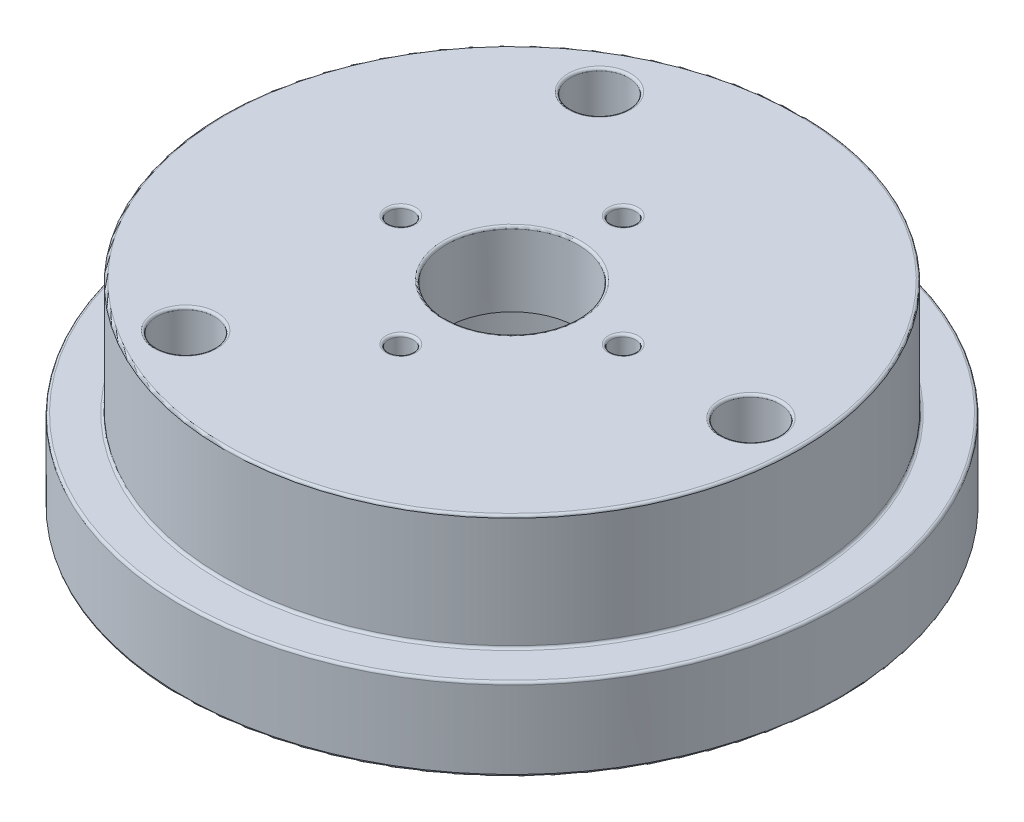
ISO-10303-21;
HEADER;
FILE_DESCRIPTION(('STEP AP214'),'2;1');
FILE_NAME('part.step','',(''),(''),'','','');
FILE_SCHEMA(('AUTOMOTIVE_DESIGN { 1 0 10303 214 1 1 1 1 }'));
ENDSEC;
DATA;
#1=APPLICATION_CONTEXT('core data for automotive mechanical design processes');
#2=APPLICATION_PROTOCOL_DEFINITION('international standard','automotive_design',2000,#1);
#3=PRODUCT_CONTEXT('',#1,'mechanical');
#4=PRODUCT('Part','Part','',(#3));
#5=PRODUCT_RELATED_PRODUCT_CATEGORY('part','',(#4));
#6=PRODUCT_DEFINITION_FORMATION('','',#4);
#7=PRODUCT_DEFINITION_CONTEXT('part definition',#1,'design');
#8=PRODUCT_DEFINITION('design','',#6,#7);
#9=PRODUCT_DEFINITION_SHAPE('','',#8);
#10=(LENGTH_UNIT() NAMED_UNIT(*) SI_UNIT(.MILLI.,.METRE.));
#11=(NAMED_UNIT(*) PLANE_ANGLE_UNIT() SI_UNIT($,.RADIAN.));
#12=(NAMED_UNIT(*) SI_UNIT($,.STERADIAN.) SOLID_ANGLE_UNIT());
#13=UNCERTAINTY_MEASURE_WITH_UNIT(LENGTH_MEASURE(1.E-05),#10,'distance_accuracy_value','');
#14=(GEOMETRIC_REPRESENTATION_CONTEXT(3) GLOBAL_UNCERTAINTY_ASSIGNED_CONTEXT((#13)) GLOBAL_UNIT_ASSIGNED_CONTEXT((#10,
#11,#12)) REPRESENTATION_CONTEXT('',''));
#15=CARTESIAN_POINT('',(0.,0.,0.));
#16=DIRECTION('',(0.,0.,1.));
#17=DIRECTION('',(1.,0.,0.));
#18=AXIS2_PLACEMENT_3D('',#15,#16,#17);
#19=CARTESIAN_POINT('',(0.,12.,0.));
#20=DIRECTION('',(0.,-1.,0.));
#21=DIRECTION('',(1.,0.,0.));
#22=AXIS2_PLACEMENT_3D('',#19,#20,#21);
#23=CYLINDRICAL_SURFACE('',#22,4.);
#24=CARTESIAN_POINT('',(0.,11.85,0.));
#25=DIRECTION('',(0.,1.,0.));
#26=DIRECTION('',(-1.,0.,0.));
#27=AXIS2_PLACEMENT_3D('',#24,#25,#26);
#28=CIRCLE('',#27,4.);
#29=CARTESIAN_POINT('',(-4.,11.85,0.));
#30=VERTEX_POINT('',#29);
#31=EDGE_CURVE('E56',#30,#30,#28,.T.);
#32=ORIENTED_EDGE('',*,*,#31,.T.);
#33=EDGE_LOOP('',(#32));
#34=FACE_BOUND('',#33,.T.);
#35=CARTESIAN_POINT('',(0.,7.5,0.));
#36=DIRECTION('',(0.,-1.,0.));
#37=DIRECTION('',(1.,0.,0.));
#38=AXIS2_PLACEMENT_3D('',#35,#36,#37);
#39=CIRCLE('',#38,4.);
#40=CARTESIAN_POINT('',(4.,7.5,0.));
#41=VERTEX_POINT('',#40);
#42=EDGE_CURVE('E143',#41,#41,#39,.T.);
#43=ORIENTED_EDGE('',*,*,#42,.T.);
#44=EDGE_LOOP('',(#43));
#45=FACE_BOUND('',#44,.T.);
#46=ADVANCED_FACE('F36',(#34,#45),#23,.F.);
#47=CARTESIAN_POINT('',(0.,12.,6.75));
#48=DIRECTION('',(0.,-1.,0.));
#49=DIRECTION('',(1.,0.,0.));
#50=AXIS2_PLACEMENT_3D('',#47,#48,#49);
#51=CYLINDRICAL_SURFACE('',#50,0.75);
#52=CARTESIAN_POINT('',(0.,11.85,6.75));
#53=DIRECTION('',(0.,1.,0.));
#54=DIRECTION('',(-1.,0.,0.));
#55=AXIS2_PLACEMENT_3D('',#52,#53,#54);
#56=CIRCLE('',#55,0.75);
#57=CARTESIAN_POINT('',(-0.75,11.85,6.75));
#58=VERTEX_POINT('',#57);
#59=EDGE_CURVE('E51',#58,#58,#56,.T.);
#60=ORIENTED_EDGE('',*,*,#59,.T.);
#61=EDGE_LOOP('',(#60));
#62=FACE_BOUND('',#61,.T.);
#63=CARTESIAN_POINT('',(0.,7.5,6.75));
#64=DIRECTION('',(0.,-1.,0.));
#65=DIRECTION('',(1.,0.,0.));
#66=AXIS2_PLACEMENT_3D('',#63,#64,#65);
#67=CIRCLE('',#66,0.75);
#68=CARTESIAN_POINT('',(0.75,7.5,6.75));
#69=VERTEX_POINT('',#68);
#70=EDGE_CURVE('E155',#69,#69,#67,.T.);
#71=ORIENTED_EDGE('',*,*,#70,.T.);
#72=EDGE_LOOP('',(#71));
#73=FACE_BOUND('',#72,.T.);
#74=ADVANCED_FACE('F159',(#62,#73),#51,.F.);
#75=CARTESIAN_POINT('',(-6.75,12.,0.));
#76=DIRECTION('',(0.,-1.,0.));
#77=DIRECTION('',(1.,0.,0.));
#78=AXIS2_PLACEMENT_3D('',#75,#76,#77);
#79=CYLINDRICAL_SURFACE('',#78,0.749999999999999);
#80=CARTESIAN_POINT('',(-6.75,11.85,0.));
#81=DIRECTION('',(0.,1.,0.));
#82=DIRECTION('',(-1.,0.,0.));
#83=AXIS2_PLACEMENT_3D('',#80,#81,#82);
#84=CIRCLE('',#83,0.749999999999999);
#85=CARTESIAN_POINT('',(-7.5,11.85,0.));
#86=VERTEX_POINT('',#85);
#87=EDGE_CURVE('E47',#86,#86,#84,.T.);
#88=ORIENTED_EDGE('',*,*,#87,.T.);
#89=EDGE_LOOP('',(#88));
#90=FACE_BOUND('',#89,.T.);
#91=CARTESIAN_POINT('',(-6.75,7.5,0.));
#92=DIRECTION('',(0.,-1.,0.));
#93=DIRECTION('',(1.,0.,0.));
#94=AXIS2_PLACEMENT_3D('',#91,#92,#93);
#95=CIRCLE('',#94,0.749999999999999);
#96=CARTESIAN_POINT('',(-6.,7.5,0.));
#97=VERTEX_POINT('',#96);
#98=EDGE_CURVE('E152',#97,#97,#95,.T.);
#99=ORIENTED_EDGE('',*,*,#98,.T.);
#100=EDGE_LOOP('',(#99));
#101=FACE_BOUND('',#100,.T.);
#102=ADVANCED_FACE('F194',(#90,#101),#79,.F.);
#103=CARTESIAN_POINT('',(6.75,12.,0.));
#104=DIRECTION('',(0.,-1.,0.));
#105=DIRECTION('',(1.,0.,0.));
#106=AXIS2_PLACEMENT_3D('',#103,#104,#105);
#107=CYLINDRICAL_SURFACE('',#106,0.749999999999999);
#108=CARTESIAN_POINT('',(6.75,11.85,0.));
#109=DIRECTION('',(0.,1.,0.));
#110=DIRECTION('',(-1.,0.,0.));
#111=AXIS2_PLACEMENT_3D('',#108,#109,#110);
#112=CIRCLE('',#111,0.749999999999999);
#113=CARTESIAN_POINT('',(6.,11.85,0.));
#114=VERTEX_POINT('',#113);
#115=EDGE_CURVE('E43',#114,#114,#112,.T.);
#116=ORIENTED_EDGE('',*,*,#115,.T.);
#117=EDGE_LOOP('',(#116));
#118=FACE_BOUND('',#117,.T.);
#119=CARTESIAN_POINT('',(6.75,7.5,0.));
#120=DIRECTION('',(0.,-1.,0.));
#121=DIRECTION('',(1.,0.,0.));
#122=AXIS2_PLACEMENT_3D('',#119,#120,#121);
#123=CIRCLE('',#122,0.749999999999999);
#124=CARTESIAN_POINT('',(7.5,7.5,0.));
#125=VERTEX_POINT('',#124);
#126=EDGE_CURVE('E146',#125,#125,#123,.T.);
#127=ORIENTED_EDGE('',*,*,#126,.T.);
#128=EDGE_LOOP('',(#127));
#129=FACE_BOUND('',#128,.T.);
#130=ADVANCED_FACE('F452',(#118,#129),#107,.F.);
#131=CARTESIAN_POINT('',(0.,12.,-6.75));
#132=DIRECTION('',(0.,-1.,0.));
#133=DIRECTION('',(1.,0.,0.));
#134=AXIS2_PLACEMENT_3D('',#131,#132,#133);
#135=CYLINDRICAL_SURFACE('',#134,0.75);
#136=CARTESIAN_POINT('',(0.,11.85,-6.75));
#137=DIRECTION('',(0.,1.,0.));
#138=DIRECTION('',(-1.,0.,0.));
#139=AXIS2_PLACEMENT_3D('',#136,#137,#138);
#140=CIRCLE('',#139,0.75);
#141=CARTESIAN_POINT('',(-0.749999999999999,11.85,-6.75));
#142=VERTEX_POINT('',#141);
#143=EDGE_CURVE('E10',#142,#142,#140,.T.);
#144=ORIENTED_EDGE('',*,*,#143,.T.);
#145=EDGE_LOOP('',(#144));
#146=FACE_BOUND('',#145,.T.);
#147=CARTESIAN_POINT('',(0.,7.5,-6.75));
#148=DIRECTION('',(0.,-1.,0.));
#149=DIRECTION('',(1.,0.,0.));
#150=AXIS2_PLACEMENT_3D('',#147,#148,#149);
#151=CIRCLE('',#150,0.75);
#152=CARTESIAN_POINT('',(0.750000000000001,7.5,-6.75));
#153=VERTEX_POINT('',#152);
#154=EDGE_CURVE('E149',#153,#153,#151,.T.);
#155=ORIENTED_EDGE('',*,*,#154,.T.);
#156=EDGE_LOOP('',(#155));
#157=FACE_BOUND('',#156,.T.);
#158=ADVANCED_FACE('F220',(#146,#157),#135,.F.);
#159=CARTESIAN_POINT('',(0.,0.,0.));
#160=DIRECTION('',(0.,-1.,0.));
#161=DIRECTION('',(1.,0.,0.));
#162=AXIS2_PLACEMENT_3D('',#159,#160,#161);
#163=PLANE('',#162);
#164=CARTESIAN_POINT('',(0.,0.,0.));
#165=DIRECTION('',(0.,-1.,0.));
#166=DIRECTION('',(1.,0.,0.));
#167=AXIS2_PLACEMENT_3D('',#164,#165,#166);
#168=CIRCLE('',#167,19.85);
#169=CARTESIAN_POINT('',(19.85,0.,0.));
#170=VERTEX_POINT('',#169);
#171=EDGE_CURVE('E119',#170,#170,#168,.T.);
#172=ORIENTED_EDGE('',*,*,#171,.T.);
#173=EDGE_LOOP('',(#172));
#174=FACE_BOUND('',#173,.T.);
#175=CARTESIAN_POINT('',(-7.25,0.,12.5573683548744));
#176=DIRECTION('',(0.,-1.,0.));
#177=DIRECTION('',(1.,0.,0.));
#178=AXIS2_PLACEMENT_3D('',#175,#176,#177);
#179=CIRCLE('',#178,1.89999999999996);
#180=CARTESIAN_POINT('',(-5.35000000000004,0.,12.5573683548744));
#181=VERTEX_POINT('',#180);
#182=EDGE_CURVE('E122',#181,#181,#179,.F.);
#183=ORIENTED_EDGE('',*,*,#182,.T.);
#184=EDGE_LOOP('',(#183));
#185=FACE_BOUND('',#184,.T.);
#186=CARTESIAN_POINT('',(14.5,0.,0.));
#187=DIRECTION('',(0.,-1.,0.));
#188=DIRECTION('',(1.,0.,0.));
#189=AXIS2_PLACEMENT_3D('',#186,#187,#188);
#190=CIRCLE('',#189,1.9);
#191=CARTESIAN_POINT('',(16.4,0.,0.));
#192=VERTEX_POINT('',#191);
#193=EDGE_CURVE('E125',#192,#192,#190,.F.);
#194=ORIENTED_EDGE('',*,*,#193,.T.);
#195=EDGE_LOOP('',(#194));
#196=FACE_BOUND('',#195,.T.);
#197=CARTESIAN_POINT('',(-7.24999999999999,0.,-12.5573683548744));
#198=DIRECTION('',(0.,-1.,0.));
#199=DIRECTION('',(1.,0.,0.));
#200=AXIS2_PLACEMENT_3D('',#197,#198,#199);
#201=CIRCLE('',#200,1.89999999999998);
#202=CARTESIAN_POINT('',(-5.35000000000002,0.,-12.5573683548744));
#203=VERTEX_POINT('',#202);
#204=EDGE_CURVE('E128',#203,#203,#201,.F.);
#205=ORIENTED_EDGE('',*,*,#204,.T.);
#206=EDGE_LOOP('',(#205));
#207=FACE_BOUND('',#206,.T.);
#208=CARTESIAN_POINT('',(0.,0.,0.));
#209=DIRECTION('',(0.,-1.,0.));
#210=DIRECTION('',(1.,0.,0.));
#211=AXIS2_PLACEMENT_3D('',#208,#209,#210);
#212=CIRCLE('',#211,10.15);
#213=CARTESIAN_POINT('',(10.15,0.,0.));
#214=VERTEX_POINT('',#213);
#215=EDGE_CURVE('E131',#214,#214,#212,.F.);
#216=ORIENTED_EDGE('',*,*,#215,.T.);
#217=EDGE_LOOP('',(#216));
#218=FACE_BOUND('',#217,.T.);
#219=ADVANCED_FACE('F216',(#174,#185,#196,#207,#218),#163,.T.);
#220=CARTESIAN_POINT('',(0.,12.,0.));
#221=DIRECTION('',(0.,1.,0.));
#222=DIRECTION('',(-1.,0.,0.));
#223=AXIS2_PLACEMENT_3D('',#220,#221,#222);
#224=CYLINDRICAL_SURFACE('',#223,20.);
#225=CARTESIAN_POINT('',(0.,0.149999999999999,0.));
#226=DIRECTION('',(0.,-1.,0.));
#227=DIRECTION('',(1.,0.,0.));
#228=AXIS2_PLACEMENT_3D('',#225,#226,#227);
#229=CIRCLE('',#228,20.);
#230=CARTESIAN_POINT('',(20.,0.149999999999999,0.));
#231=VERTEX_POINT('',#230);
#232=EDGE_CURVE('E134',#231,#231,#229,.F.);
#233=ORIENTED_EDGE('',*,*,#232,.T.);
#234=EDGE_LOOP('',(#233));
#235=FACE_BOUND('',#234,.T.);
#236=CARTESIAN_POINT('',(0.,4.85,0.));
#237=DIRECTION('',(0.,1.,0.));
#238=DIRECTION('',(-1.,0.,0.));
#239=AXIS2_PLACEMENT_3D('',#236,#237,#238);
#240=CIRCLE('',#239,20.);
#241=CARTESIAN_POINT('',(-20.,4.85,0.));
#242=VERTEX_POINT('',#241);
#243=EDGE_CURVE('E137',#242,#242,#240,.F.);
#244=ORIENTED_EDGE('',*,*,#243,.T.);
#245=EDGE_LOOP('',(#244));
#246=FACE_BOUND('',#245,.T.);
#247=ADVANCED_FACE('F212',(#235,#246),#224,.T.);
#248=CARTESIAN_POINT('',(-20.,5.,0.));
#249=DIRECTION('',(0.,1.,0.));
#250=DIRECTION('',(-1.,0.,0.));
#251=AXIS2_PLACEMENT_3D('',#248,#249,#250);
#252=PLANE('',#251);
#253=CARTESIAN_POINT('',(0.,5.,0.));
#254=DIRECTION('',(0.,1.,0.));
#255=DIRECTION('',(-1.,0.,0.));
#256=AXIS2_PLACEMENT_3D('',#253,#254,#255);
#257=CIRCLE('',#256,17.65);
#258=CARTESIAN_POINT('',(-17.65,5.,0.));
#259=VERTEX_POINT('',#258);
#260=EDGE_CURVE('E86',#259,#259,#257,.F.);
#261=ORIENTED_EDGE('',*,*,#260,.T.);
#262=EDGE_LOOP('',(#261));
#263=FACE_BOUND('',#262,.T.);
#264=CARTESIAN_POINT('',(0.,5.,0.));
#265=DIRECTION('',(0.,1.,0.));
#266=DIRECTION('',(-1.,0.,0.));
#267=AXIS2_PLACEMENT_3D('',#264,#265,#266);
#268=CIRCLE('',#267,19.85);
#269=CARTESIAN_POINT('',(-19.85,5.,0.));
#270=VERTEX_POINT('',#269);
#271=EDGE_CURVE('E89',#270,#270,#268,.T.);
#272=ORIENTED_EDGE('',*,*,#271,.T.);
#273=EDGE_LOOP('',(#272));
#274=FACE_BOUND('',#273,.T.);
#275=ADVANCED_FACE('F208',(#263,#274),#252,.T.);
#276=CARTESIAN_POINT('',(0.,12.,0.));
#277=DIRECTION('',(0.,1.,0.));
#278=DIRECTION('',(-1.,0.,0.));
#279=AXIS2_PLACEMENT_3D('',#276,#277,#278);
#280=CYLINDRICAL_SURFACE('',#279,17.5);
#281=CARTESIAN_POINT('',(0.,5.15,0.));
#282=DIRECTION('',(0.,1.,0.));
#283=DIRECTION('',(-1.,0.,0.));
#284=AXIS2_PLACEMENT_3D('',#281,#282,#283);
#285=CIRCLE('',#284,17.5);
#286=CARTESIAN_POINT('',(-17.5,5.15,0.));
#287=VERTEX_POINT('',#286);
#288=EDGE_CURVE('E92',#287,#287,#285,.T.);
#289=ORIENTED_EDGE('',*,*,#288,.T.);
#290=EDGE_LOOP('',(#289));
#291=FACE_BOUND('',#290,.T.);
#292=CARTESIAN_POINT('',(0.,11.85,0.));
#293=DIRECTION('',(0.,1.,0.));
#294=DIRECTION('',(-1.,0.,0.));
#295=AXIS2_PLACEMENT_3D('',#292,#293,#294);
#296=CIRCLE('',#295,17.5);
#297=CARTESIAN_POINT('',(-17.5,11.85,0.));
#298=VERTEX_POINT('',#297);
#299=EDGE_CURVE('E95',#298,#298,#296,.F.);
#300=ORIENTED_EDGE('',*,*,#299,.T.);
#301=EDGE_LOOP('',(#300));
#302=FACE_BOUND('',#301,.T.);
#303=ADVANCED_FACE('F204',(#291,#302),#280,.T.);
#304=CARTESIAN_POINT('',(-17.5,12.,0.));
#305=DIRECTION('',(0.,1.,0.));
#306=DIRECTION('',(-1.,0.,0.));
#307=AXIS2_PLACEMENT_3D('',#304,#305,#306);
#308=PLANE('',#307);
#309=CARTESIAN_POINT('',(0.,12.,0.));
#310=DIRECTION('',(0.,1.,0.));
#311=DIRECTION('',(-1.,0.,0.));
#312=AXIS2_PLACEMENT_3D('',#309,#310,#311);
#313=CIRCLE('',#312,17.35);
#314=CARTESIAN_POINT('',(-17.35,12.,0.));
#315=VERTEX_POINT('',#314);
#316=EDGE_CURVE('E59',#315,#315,#313,.T.);
#317=ORIENTED_EDGE('',*,*,#316,.T.);
#318=EDGE_LOOP('',(#317));
#319=FACE_BOUND('',#318,.T.);
#320=CARTESIAN_POINT('',(0.,12.,0.));
#321=DIRECTION('',(0.,1.,0.));
#322=DIRECTION('',(-1.,0.,0.));
#323=AXIS2_PLACEMENT_3D('',#320,#321,#322);
#324=CIRCLE('',#323,4.15);
#325=CARTESIAN_POINT('',(-4.15,12.,0.));
#326=VERTEX_POINT('',#325);
#327=EDGE_CURVE('E62',#326,#326,#324,.F.);
#328=ORIENTED_EDGE('',*,*,#327,.T.);
#329=EDGE_LOOP('',(#328));
#330=FACE_BOUND('',#329,.T.);
#331=CARTESIAN_POINT('',(-7.25,12.,12.5573683548744));
#332=DIRECTION('',(0.,1.,0.));
#333=DIRECTION('',(-1.,0.,0.));
#334=AXIS2_PLACEMENT_3D('',#331,#332,#333);
#335=CIRCLE('',#334,1.89999999999996);
#336=CARTESIAN_POINT('',(-9.14999999999996,12.,12.5573683548744));
#337=VERTEX_POINT('',#336);
#338=EDGE_CURVE('E65',#337,#337,#335,.F.);
#339=ORIENTED_EDGE('',*,*,#338,.T.);
#340=EDGE_LOOP('',(#339));
#341=FACE_BOUND('',#340,.T.);
#342=CARTESIAN_POINT('',(14.5,12.,0.));
#343=DIRECTION('',(0.,1.,0.));
#344=DIRECTION('',(-1.,0.,0.));
#345=AXIS2_PLACEMENT_3D('',#342,#343,#344);
#346=CIRCLE('',#345,1.9);
#347=CARTESIAN_POINT('',(12.6,12.,0.));
#348=VERTEX_POINT('',#347);
#349=EDGE_CURVE('E68',#348,#348,#346,.F.);
#350=ORIENTED_EDGE('',*,*,#349,.T.);
#351=EDGE_LOOP('',(#350));
#352=FACE_BOUND('',#351,.T.);
#353=CARTESIAN_POINT('',(0.,12.,6.75));
#354=DIRECTION('',(0.,1.,0.));
#355=DIRECTION('',(-1.,0.,0.));
#356=AXIS2_PLACEMENT_3D('',#353,#354,#355);
#357=CIRCLE('',#356,0.9);
#358=CARTESIAN_POINT('',(-0.9,12.,6.75));
#359=VERTEX_POINT('',#358);
#360=EDGE_CURVE('E71',#359,#359,#357,.F.);
#361=ORIENTED_EDGE('',*,*,#360,.T.);
#362=EDGE_LOOP('',(#361));
#363=FACE_BOUND('',#362,.T.);
#364=CARTESIAN_POINT('',(-6.75,12.,0.));
#365=DIRECTION('',(0.,1.,0.));
#366=DIRECTION('',(-1.,0.,0.));
#367=AXIS2_PLACEMENT_3D('',#364,#365,#366);
#368=CIRCLE('',#367,0.899999999999999);
#369=CARTESIAN_POINT('',(-7.65,12.,0.));
#370=VERTEX_POINT('',#369);
#371=EDGE_CURVE('E74',#370,#370,#368,.F.);
#372=ORIENTED_EDGE('',*,*,#371,.T.);
#373=EDGE_LOOP('',(#372));
#374=FACE_BOUND('',#373,.T.);
#375=CARTESIAN_POINT('',(6.75,12.,0.));
#376=DIRECTION('',(0.,1.,0.));
#377=DIRECTION('',(-1.,0.,0.));
#378=AXIS2_PLACEMENT_3D('',#375,#376,#377);
#379=CIRCLE('',#378,0.899999999999999);
#380=CARTESIAN_POINT('',(5.85,12.,0.));
#381=VERTEX_POINT('',#380);
#382=EDGE_CURVE('E77',#381,#381,#379,.F.);
#383=ORIENTED_EDGE('',*,*,#382,.T.);
#384=EDGE_LOOP('',(#383));
#385=FACE_BOUND('',#384,.T.);
#386=CARTESIAN_POINT('',(0.,12.,-6.75));
#387=DIRECTION('',(0.,1.,0.));
#388=DIRECTION('',(-1.,0.,0.));
#389=AXIS2_PLACEMENT_3D('',#386,#387,#388);
#390=CIRCLE('',#389,0.9);
#391=CARTESIAN_POINT('',(-0.899999999999999,12.,-6.75));
#392=VERTEX_POINT('',#391);
#393=EDGE_CURVE('E80',#392,#392,#390,.F.);
#394=ORIENTED_EDGE('',*,*,#393,.T.);
#395=EDGE_LOOP('',(#394));
#396=FACE_BOUND('',#395,.T.);
#397=CARTESIAN_POINT('',(-7.24999999999999,12.,-12.5573683548744));
#398=DIRECTION('',(0.,1.,0.));
#399=DIRECTION('',(-1.,0.,0.));
#400=AXIS2_PLACEMENT_3D('',#397,#398,#399);
#401=CIRCLE('',#400,1.89999999999998);
#402=CARTESIAN_POINT('',(-9.14999999999997,12.,-12.5573683548744));
#403=VERTEX_POINT('',#402);
#404=EDGE_CURVE('E83',#403,#403,#401,.F.);
#405=ORIENTED_EDGE('',*,*,#404,.T.);
#406=EDGE_LOOP('',(#405));
#407=FACE_BOUND('',#406,.T.);
#408=ADVANCED_FACE('F200',(#319,#330,#341,#352,#363,#374,#385,#396,#407),#308,.T.);
#409=CARTESIAN_POINT('',(-7.25,12.,12.5573683548744));
#410=DIRECTION('',(0.,-1.,0.));
#411=DIRECTION('',(1.,0.,0.));
#412=AXIS2_PLACEMENT_3D('',#409,#410,#411);
#413=CYLINDRICAL_SURFACE('',#412,1.74999999999996);
#414=CARTESIAN_POINT('',(-7.25,0.149999999999999,12.5573683548744));
#415=DIRECTION('',(0.,-1.,0.));
#416=DIRECTION('',(1.,0.,0.));
#417=AXIS2_PLACEMENT_3D('',#414,#415,#416);
#418=CIRCLE('',#417,1.74999999999996);
#419=CARTESIAN_POINT('',(-5.50000000000004,0.149999999999999,12.5573683548744));
#420=VERTEX_POINT('',#419);
#421=EDGE_CURVE('E113',#420,#420,#418,.T.);
#422=ORIENTED_EDGE('',*,*,#421,.T.);
#423=EDGE_LOOP('',(#422));
#424=FACE_BOUND('',#423,.T.);
#425=CARTESIAN_POINT('',(-7.25,11.85,12.5573683548744));
#426=DIRECTION('',(0.,1.,0.));
#427=DIRECTION('',(-1.,0.,0.));
#428=AXIS2_PLACEMENT_3D('',#425,#426,#427);
#429=CIRCLE('',#428,1.74999999999996);
#430=CARTESIAN_POINT('',(-8.99999999999996,11.85,12.5573683548744));
#431=VERTEX_POINT('',#430);
#432=EDGE_CURVE('E116',#431,#431,#429,.T.);
#433=ORIENTED_EDGE('',*,*,#432,.T.);
#434=EDGE_LOOP('',(#433));
#435=FACE_BOUND('',#434,.T.);
#436=ADVANCED_FACE('F203',(#424,#435),#413,.F.);
#437=CARTESIAN_POINT('',(14.5,12.,0.));
#438=DIRECTION('',(0.,-1.,0.));
#439=DIRECTION('',(1.,0.,0.));
#440=AXIS2_PLACEMENT_3D('',#437,#438,#439);
#441=CYLINDRICAL_SURFACE('',#440,1.75);
#442=CARTESIAN_POINT('',(14.5,0.149999999999999,0.));
#443=DIRECTION('',(0.,-1.,0.));
#444=DIRECTION('',(1.,0.,0.));
#445=AXIS2_PLACEMENT_3D('',#442,#443,#444);
#446=CIRCLE('',#445,1.75);
#447=CARTESIAN_POINT('',(16.25,0.149999999999999,0.));
#448=VERTEX_POINT('',#447);
#449=EDGE_CURVE('E107',#448,#448,#446,.T.);
#450=ORIENTED_EDGE('',*,*,#449,.T.);
#451=EDGE_LOOP('',(#450));
#452=FACE_BOUND('',#451,.T.);
#453=CARTESIAN_POINT('',(14.5,11.85,0.));
#454=DIRECTION('',(0.,1.,0.));
#455=DIRECTION('',(-1.,0.,0.));
#456=AXIS2_PLACEMENT_3D('',#453,#454,#455);
#457=CIRCLE('',#456,1.75);
#458=CARTESIAN_POINT('',(12.75,11.85,0.));
#459=VERTEX_POINT('',#458);
#460=EDGE_CURVE('E110',#459,#459,#457,.T.);
#461=ORIENTED_EDGE('',*,*,#460,.T.);
#462=EDGE_LOOP('',(#461));
#463=FACE_BOUND('',#462,.T.);
#464=ADVANCED_FACE('F184',(#452,#463),#441,.F.);
#465=CARTESIAN_POINT('',(-7.24999999999999,12.,-12.5573683548744));
#466=DIRECTION('',(0.,-1.,0.));
#467=DIRECTION('',(1.,0.,0.));
#468=AXIS2_PLACEMENT_3D('',#465,#466,#467);
#469=CYLINDRICAL_SURFACE('',#468,1.74999999999998);
#470=CARTESIAN_POINT('',(-7.24999999999999,0.149999999999999,-12.5573683548744));
#471=DIRECTION('',(0.,-1.,0.));
#472=DIRECTION('',(1.,0.,0.));
#473=AXIS2_PLACEMENT_3D('',#470,#471,#472);
#474=CIRCLE('',#473,1.74999999999998);
#475=CARTESIAN_POINT('',(-5.50000000000002,0.149999999999999,-12.5573683548744));
#476=VERTEX_POINT('',#475);
#477=EDGE_CURVE('E101',#476,#476,#474,.T.);
#478=ORIENTED_EDGE('',*,*,#477,.T.);
#479=EDGE_LOOP('',(#478));
#480=FACE_BOUND('',#479,.T.);
#481=CARTESIAN_POINT('',(-7.24999999999999,11.85,-12.5573683548744));
#482=DIRECTION('',(0.,1.,0.));
#483=DIRECTION('',(-1.,0.,0.));
#484=AXIS2_PLACEMENT_3D('',#481,#482,#483);
#485=CIRCLE('',#484,1.74999999999998);
#486=CARTESIAN_POINT('',(-8.99999999999997,11.85,-12.5573683548744));
#487=VERTEX_POINT('',#486);
#488=EDGE_CURVE('E104',#487,#487,#485,.T.);
#489=ORIENTED_EDGE('',*,*,#488,.T.);
#490=EDGE_LOOP('',(#489));
#491=FACE_BOUND('',#490,.T.);
#492=ADVANCED_FACE('F178',(#480,#491),#469,.F.);
#493=CARTESIAN_POINT('',(0.,7.5,0.));
#494=DIRECTION('',(0.,-1.,0.));
#495=DIRECTION('',(1.,0.,0.));
#496=AXIS2_PLACEMENT_3D('',#493,#494,#495);
#497=CYLINDRICAL_SURFACE('',#496,10.);
#498=CARTESIAN_POINT('',(0.,0.15,0.));
#499=DIRECTION('',(0.,-1.,0.));
#500=DIRECTION('',(1.,0.,0.));
#501=AXIS2_PLACEMENT_3D('',#498,#499,#500);
#502=CIRCLE('',#501,10.);
#503=CARTESIAN_POINT('',(10.,0.15,0.));
#504=VERTEX_POINT('',#503);
#505=EDGE_CURVE('E98',#504,#504,#502,.T.);
#506=ORIENTED_EDGE('',*,*,#505,.T.);
#507=EDGE_LOOP('',(#506));
#508=FACE_BOUND('',#507,.T.);
#509=CARTESIAN_POINT('',(0.,7.5,0.));
#510=DIRECTION('',(0.,-1.,0.));
#511=DIRECTION('',(1.,0.,0.));
#512=AXIS2_PLACEMENT_3D('',#509,#510,#511);
#513=CIRCLE('',#512,10.);
#514=CARTESIAN_POINT('',(10.,7.5,0.));
#515=VERTEX_POINT('',#514);
#516=EDGE_CURVE('E140',#515,#515,#513,.T.);
#517=ORIENTED_EDGE('',*,*,#516,.F.);
#518=EDGE_LOOP('',(#517));
#519=FACE_BOUND('',#518,.T.);
#520=ADVANCED_FACE('F165',(#508,#519),#497,.F.);
#521=CARTESIAN_POINT('',(0.,7.5,0.));
#522=DIRECTION('',(0.,-1.,0.));
#523=DIRECTION('',(1.,0.,0.));
#524=AXIS2_PLACEMENT_3D('',#521,#522,#523);
#525=PLANE('',#524);
#526=ORIENTED_EDGE('',*,*,#70,.F.);
#527=EDGE_LOOP('',(#526));
#528=FACE_BOUND('',#527,.T.);
#529=ORIENTED_EDGE('',*,*,#98,.F.);
#530=EDGE_LOOP('',(#529));
#531=FACE_BOUND('',#530,.T.);
#532=ORIENTED_EDGE('',*,*,#154,.F.);
#533=EDGE_LOOP('',(#532));
#534=FACE_BOUND('',#533,.T.);
#535=ORIENTED_EDGE('',*,*,#126,.F.);
#536=EDGE_LOOP('',(#535));
#537=FACE_BOUND('',#536,.T.);
#538=ORIENTED_EDGE('',*,*,#42,.F.);
#539=EDGE_LOOP('',(#538));
#540=FACE_BOUND('',#539,.T.);
#541=ORIENTED_EDGE('',*,*,#516,.T.);
#542=EDGE_LOOP('',(#541));
#543=FACE_BOUND('',#542,.T.);
#544=ADVANCED_FACE('F161',(#528,#531,#534,#537,#540,#543),#525,.T.);
#545=CARTESIAN_POINT('',(0.,0.149999999999999,0.));
#546=DIRECTION('',(0.,-1.,0.));
#547=DIRECTION('',(1.,0.,0.));
#548=AXIS2_PLACEMENT_3D('',#545,#546,#547);
#549=TOROIDAL_SURFACE('',#548,19.85,0.15);
#550=ORIENTED_EDGE('',*,*,#171,.F.);
#551=EDGE_LOOP('',(#550));
#552=FACE_BOUND('',#551,.T.);
#553=ORIENTED_EDGE('',*,*,#232,.F.);
#554=EDGE_LOOP('',(#553));
#555=FACE_BOUND('',#554,.T.);
#556=ADVANCED_FACE('F164',(#552,#555),#549,.T.);
#557=CARTESIAN_POINT('',(-7.25,0.149999999999999,12.5573683548744));
#558=DIRECTION('',(0.,-1.,0.));
#559=DIRECTION('',(1.,0.,0.));
#560=AXIS2_PLACEMENT_3D('',#557,#558,#559);
#561=TOROIDAL_SURFACE('',#560,1.89999999999996,0.15);
#562=ORIENTED_EDGE('',*,*,#182,.F.);
#563=EDGE_LOOP('',(#562));
#564=FACE_BOUND('',#563,.T.);
#565=ORIENTED_EDGE('',*,*,#421,.F.);
#566=EDGE_LOOP('',(#565));
#567=FACE_BOUND('',#566,.T.);
#568=ADVANCED_FACE('F224',(#564,#567),#561,.T.);
#569=CARTESIAN_POINT('',(14.5,0.149999999999999,0.));
#570=DIRECTION('',(0.,-1.,0.));
#571=DIRECTION('',(1.,0.,0.));
#572=AXIS2_PLACEMENT_3D('',#569,#570,#571);
#573=TOROIDAL_SURFACE('',#572,1.9,0.15);
#574=ORIENTED_EDGE('',*,*,#193,.F.);
#575=EDGE_LOOP('',(#574));
#576=FACE_BOUND('',#575,.T.);
#577=ORIENTED_EDGE('',*,*,#449,.F.);
#578=EDGE_LOOP('',(#577));
#579=FACE_BOUND('',#578,.T.);
#580=ADVANCED_FACE('F228',(#576,#579),#573,.T.);
#581=CARTESIAN_POINT('',(-7.24999999999999,0.149999999999999,-12.5573683548744));
#582=DIRECTION('',(0.,-1.,0.));
#583=DIRECTION('',(1.,0.,0.));
#584=AXIS2_PLACEMENT_3D('',#581,#582,#583);
#585=TOROIDAL_SURFACE('',#584,1.89999999999998,0.15);
#586=ORIENTED_EDGE('',*,*,#204,.F.);
#587=EDGE_LOOP('',(#586));
#588=FACE_BOUND('',#587,.T.);
#589=ORIENTED_EDGE('',*,*,#477,.F.);
#590=EDGE_LOOP('',(#589));
#591=FACE_BOUND('',#590,.T.);
#592=ADVANCED_FACE('F232',(#588,#591),#585,.T.);
#593=CARTESIAN_POINT('',(0.,0.15,0.));
#594=DIRECTION('',(0.,-1.,0.));
#595=DIRECTION('',(1.,0.,0.));
#596=AXIS2_PLACEMENT_3D('',#593,#594,#595);
#597=TOROIDAL_SURFACE('',#596,10.15,0.15);
#598=ORIENTED_EDGE('',*,*,#215,.F.);
#599=EDGE_LOOP('',(#598));
#600=FACE_BOUND('',#599,.T.);
#601=ORIENTED_EDGE('',*,*,#505,.F.);
#602=EDGE_LOOP('',(#601));
#603=FACE_BOUND('',#602,.T.);
#604=ADVANCED_FACE('F236',(#600,#603),#597,.T.);
#605=CARTESIAN_POINT('',(0.,5.15,0.));
#606=DIRECTION('',(0.,1.,0.));
#607=DIRECTION('',(-1.,0.,0.));
#608=AXIS2_PLACEMENT_3D('',#605,#606,#607);
#609=TOROIDAL_SURFACE('',#608,17.65,0.15);
#610=ORIENTED_EDGE('',*,*,#260,.F.);
#611=EDGE_LOOP('',(#610));
#612=FACE_BOUND('',#611,.T.);
#613=ORIENTED_EDGE('',*,*,#288,.F.);
#614=EDGE_LOOP('',(#613));
#615=FACE_BOUND('',#614,.T.);
#616=ADVANCED_FACE('F240',(#612,#615),#609,.F.);
#617=CARTESIAN_POINT('',(0.,4.85,0.));
#618=DIRECTION('',(0.,1.,0.));
#619=DIRECTION('',(-1.,0.,0.));
#620=AXIS2_PLACEMENT_3D('',#617,#618,#619);
#621=TOROIDAL_SURFACE('',#620,19.85,0.15);
#622=ORIENTED_EDGE('',*,*,#243,.F.);
#623=EDGE_LOOP('',(#622));
#624=FACE_BOUND('',#623,.T.);
#625=ORIENTED_EDGE('',*,*,#271,.F.);
#626=EDGE_LOOP('',(#625));
#627=FACE_BOUND('',#626,.T.);
#628=ADVANCED_FACE('F244',(#624,#627),#621,.T.);
#629=CARTESIAN_POINT('',(0.,11.85,0.));
#630=DIRECTION('',(0.,1.,0.));
#631=DIRECTION('',(-1.,0.,0.));
#632=AXIS2_PLACEMENT_3D('',#629,#630,#631);
#633=TOROIDAL_SURFACE('',#632,17.35,0.15);
#634=ORIENTED_EDGE('',*,*,#299,.F.);
#635=EDGE_LOOP('',(#634));
#636=FACE_BOUND('',#635,.T.);
#637=ORIENTED_EDGE('',*,*,#316,.F.);
#638=EDGE_LOOP('',(#637));
#639=FACE_BOUND('',#638,.T.);
#640=ADVANCED_FACE('F248',(#636,#639),#633,.T.);
#641=CARTESIAN_POINT('',(0.,11.85,0.));
#642=DIRECTION('',(0.,1.,0.));
#643=DIRECTION('',(-1.,0.,0.));
#644=AXIS2_PLACEMENT_3D('',#641,#642,#643);
#645=TOROIDAL_SURFACE('',#644,4.15,0.15);
#646=ORIENTED_EDGE('',*,*,#31,.F.);
#647=EDGE_LOOP('',(#646));
#648=FACE_BOUND('',#647,.T.);
#649=ORIENTED_EDGE('',*,*,#327,.F.);
#650=EDGE_LOOP('',(#649));
#651=FACE_BOUND('',#650,.T.);
#652=ADVANCED_FACE('F252',(#648,#651),#645,.T.);
#653=CARTESIAN_POINT('',(-7.25,11.85,12.5573683548744));
#654=DIRECTION('',(0.,1.,0.));
#655=DIRECTION('',(-1.,0.,0.));
#656=AXIS2_PLACEMENT_3D('',#653,#654,#655);
#657=TOROIDAL_SURFACE('',#656,1.89999999999996,0.15);
#658=ORIENTED_EDGE('',*,*,#432,.F.);
#659=EDGE_LOOP('',(#658));
#660=FACE_BOUND('',#659,.T.);
#661=ORIENTED_EDGE('',*,*,#338,.F.);
#662=EDGE_LOOP('',(#661));
#663=FACE_BOUND('',#662,.T.);
#664=ADVANCED_FACE('F256',(#660,#663),#657,.T.);
#665=CARTESIAN_POINT('',(14.5,11.85,0.));
#666=DIRECTION('',(0.,1.,0.));
#667=DIRECTION('',(-1.,0.,0.));
#668=AXIS2_PLACEMENT_3D('',#665,#666,#667);
#669=TOROIDAL_SURFACE('',#668,1.9,0.15);
#670=ORIENTED_EDGE('',*,*,#460,.F.);
#671=EDGE_LOOP('',(#670));
#672=FACE_BOUND('',#671,.T.);
#673=ORIENTED_EDGE('',*,*,#349,.F.);
#674=EDGE_LOOP('',(#673));
#675=FACE_BOUND('',#674,.T.);
#676=ADVANCED_FACE('F260',(#672,#675),#669,.T.);
#677=CARTESIAN_POINT('',(0.,11.85,6.75));
#678=DIRECTION('',(0.,1.,0.));
#679=DIRECTION('',(-1.,0.,0.));
#680=AXIS2_PLACEMENT_3D('',#677,#678,#679);
#681=TOROIDAL_SURFACE('',#680,0.9,0.15);
#682=ORIENTED_EDGE('',*,*,#59,.F.);
#683=EDGE_LOOP('',(#682));
#684=FACE_BOUND('',#683,.T.);
#685=ORIENTED_EDGE('',*,*,#360,.F.);
#686=EDGE_LOOP('',(#685));
#687=FACE_BOUND('',#686,.T.);
#688=ADVANCED_FACE('F264',(#684,#687),#681,.T.);
#689=CARTESIAN_POINT('',(-6.75,11.85,0.));
#690=DIRECTION('',(0.,1.,0.));
#691=DIRECTION('',(-1.,0.,0.));
#692=AXIS2_PLACEMENT_3D('',#689,#690,#691);
#693=TOROIDAL_SURFACE('',#692,0.899999999999999,0.15);
#694=ORIENTED_EDGE('',*,*,#87,.F.);
#695=EDGE_LOOP('',(#694));
#696=FACE_BOUND('',#695,.T.);
#697=ORIENTED_EDGE('',*,*,#371,.F.);
#698=EDGE_LOOP('',(#697));
#699=FACE_BOUND('',#698,.T.);
#700=ADVANCED_FACE('F268',(#696,#699),#693,.T.);
#701=CARTESIAN_POINT('',(6.75,11.85,0.));
#702=DIRECTION('',(0.,1.,0.));
#703=DIRECTION('',(-1.,0.,0.));
#704=AXIS2_PLACEMENT_3D('',#701,#702,#703);
#705=TOROIDAL_SURFACE('',#704,0.899999999999999,0.15);
#706=ORIENTED_EDGE('',*,*,#115,.F.);
#707=EDGE_LOOP('',(#706));
#708=FACE_BOUND('',#707,.T.);
#709=ORIENTED_EDGE('',*,*,#382,.F.);
#710=EDGE_LOOP('',(#709));
#711=FACE_BOUND('',#710,.T.);
#712=ADVANCED_FACE('F272',(#708,#711),#705,.T.);
#713=CARTESIAN_POINT('',(0.,11.85,-6.75));
#714=DIRECTION('',(0.,1.,0.));
#715=DIRECTION('',(-1.,0.,0.));
#716=AXIS2_PLACEMENT_3D('',#713,#714,#715);
#717=TOROIDAL_SURFACE('',#716,0.9,0.15);
#718=ORIENTED_EDGE('',*,*,#143,.F.);
#719=EDGE_LOOP('',(#718));
#720=FACE_BOUND('',#719,.T.);
#721=ORIENTED_EDGE('',*,*,#393,.F.);
#722=EDGE_LOOP('',(#721));
#723=FACE_BOUND('',#722,.T.);
#724=ADVANCED_FACE('F275',(#720,#723),#717,.T.);
#725=CARTESIAN_POINT('',(-7.24999999999999,11.85,-12.5573683548744));
#726=DIRECTION('',(0.,1.,0.));
#727=DIRECTION('',(-1.,0.,0.));
#728=AXIS2_PLACEMENT_3D('',#725,#726,#727);
#729=TOROIDAL_SURFACE('',#728,1.89999999999998,0.15);
#730=ORIENTED_EDGE('',*,*,#488,.F.);
#731=EDGE_LOOP('',(#730));
#732=FACE_BOUND('',#731,.T.);
#733=ORIENTED_EDGE('',*,*,#404,.F.);
#734=EDGE_LOOP('',(#733));
#735=FACE_BOUND('',#734,.T.);
#736=ADVANCED_FACE('F38',(#732,#735),#729,.T.);
#737=CLOSED_SHELL('',(#46,#74,#102,#130,#158,#219,#247,#275,#303,#408,#436,#464,#492,#520,#544,
#556,#568,#580,#592,#604,#616,#628,#640,#652,#664,#676,#688,#700,#712,#724,#736));
#738=MANIFOLD_SOLID_BREP('B2',#737);
#739=ADVANCED_BREP_SHAPE_REPRESENTATION('',(#18,#738),#14);
#740=SHAPE_DEFINITION_REPRESENTATION(#9,#739);
ENDSEC;
END-ISO-10303-21;
